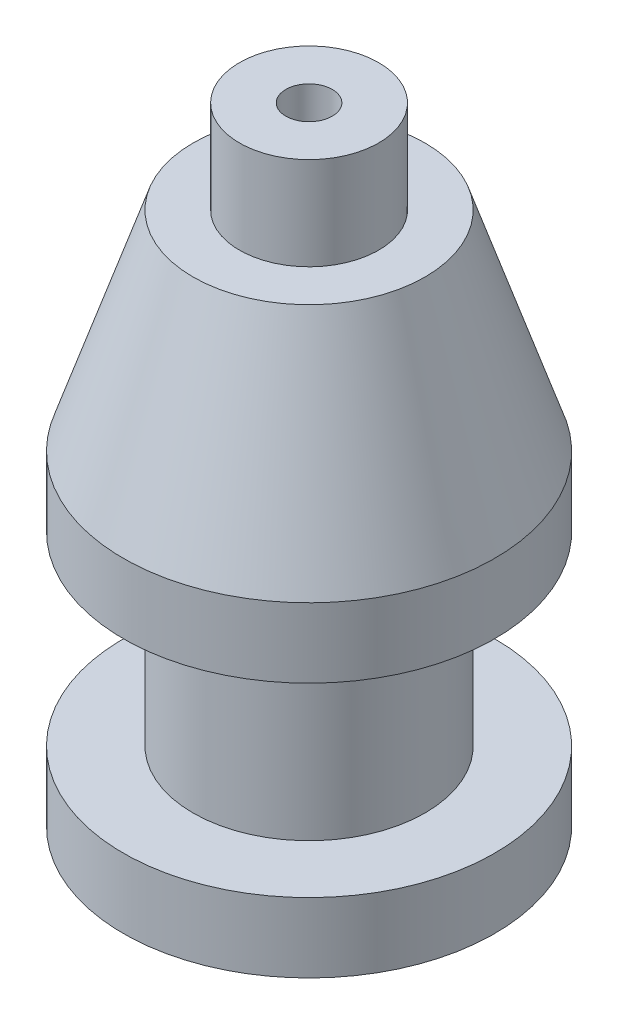
ISO-10303-21;
HEADER;
FILE_DESCRIPTION(('STEP AP214'),'2;1');
FILE_NAME('part.step','',(''),(''),'','','');
FILE_SCHEMA(('AUTOMOTIVE_DESIGN { 1 0 10303 214 1 1 1 1 }'));
ENDSEC;
DATA;
#1=APPLICATION_CONTEXT('core data for automotive mechanical design processes');
#2=APPLICATION_PROTOCOL_DEFINITION('international standard','automotive_design',2000,#1);
#3=PRODUCT_CONTEXT('',#1,'mechanical');
#4=PRODUCT('Part','Part','',(#3));
#5=PRODUCT_RELATED_PRODUCT_CATEGORY('part','',(#4));
#6=PRODUCT_DEFINITION_FORMATION('','',#4);
#7=PRODUCT_DEFINITION_CONTEXT('part definition',#1,'design');
#8=PRODUCT_DEFINITION('design','',#6,#7);
#9=PRODUCT_DEFINITION_SHAPE('','',#8);
#10=(LENGTH_UNIT() NAMED_UNIT(*) SI_UNIT(.MILLI.,.METRE.));
#11=(NAMED_UNIT(*) PLANE_ANGLE_UNIT() SI_UNIT($,.RADIAN.));
#12=(NAMED_UNIT(*) SI_UNIT($,.STERADIAN.) SOLID_ANGLE_UNIT());
#13=UNCERTAINTY_MEASURE_WITH_UNIT(LENGTH_MEASURE(1.E-05),#10,'distance_accuracy_value','');
#14=(GEOMETRIC_REPRESENTATION_CONTEXT(3) GLOBAL_UNCERTAINTY_ASSIGNED_CONTEXT((#13)) GLOBAL_UNIT_ASSIGNED_CONTEXT((#10,
#11,#12)) REPRESENTATION_CONTEXT('',''));
#15=CARTESIAN_POINT('',(0.,0.,0.));
#16=DIRECTION('',(0.,0.,1.));
#17=DIRECTION('',(1.,0.,0.));
#18=AXIS2_PLACEMENT_3D('',#15,#16,#17);
#19=CARTESIAN_POINT('',(30.,270.,0.));
#20=DIRECTION('',(0.,1.,0.));
#21=DIRECTION('',(0.,0.,1.));
#22=AXIS2_PLACEMENT_3D('',#19,#20,#21);
#23=PLANE('',#22);
#24=CARTESIAN_POINT('',(0.,270.,0.));
#25=DIRECTION('',(0.,-1.,0.));
#26=DIRECTION('',(0.,0.,-1.));
#27=AXIS2_PLACEMENT_3D('',#24,#25,#26);
#28=CIRCLE('',#27,10.);
#29=CARTESIAN_POINT('',(0.,270.,-10.));
#30=VERTEX_POINT('',#29);
#31=EDGE_CURVE('E10',#30,#30,#28,.T.);
#32=ORIENTED_EDGE('',*,*,#31,.T.);
#33=EDGE_LOOP('',(#32));
#34=FACE_BOUND('',#33,.T.);
#35=CARTESIAN_POINT('',(0.,270.,0.));
#36=DIRECTION('',(0.,-1.,0.));
#37=DIRECTION('',(0.,0.,-1.));
#38=AXIS2_PLACEMENT_3D('',#35,#36,#37);
#39=CIRCLE('',#38,30.);
#40=CARTESIAN_POINT('',(0.,270.,-30.));
#41=VERTEX_POINT('',#40);
#42=EDGE_CURVE('E72',#41,#41,#39,.T.);
#43=ORIENTED_EDGE('',*,*,#42,.F.);
#44=EDGE_LOOP('',(#43));
#45=FACE_BOUND('',#44,.T.);
#46=ADVANCED_FACE('F35',(#34,#45),#23,.T.);
#47=CARTESIAN_POINT('',(0.,0.,0.));
#48=DIRECTION('',(0.,-1.,0.));
#49=DIRECTION('',(0.,0.,-1.));
#50=AXIS2_PLACEMENT_3D('',#47,#48,#49);
#51=CYLINDRICAL_SURFACE('',#50,10.);
#52=CARTESIAN_POINT('',(0.,0.,0.));
#53=DIRECTION('',(0.,-1.,0.));
#54=DIRECTION('',(0.,0.,-1.));
#55=AXIS2_PLACEMENT_3D('',#52,#53,#54);
#56=CIRCLE('',#55,10.);
#57=CARTESIAN_POINT('',(0.,0.,-10.));
#58=VERTEX_POINT('',#57);
#59=EDGE_CURVE('E41',#58,#58,#56,.T.);
#60=ORIENTED_EDGE('',*,*,#59,.T.);
#61=EDGE_LOOP('',(#60));
#62=FACE_BOUND('',#61,.T.);
#63=ORIENTED_EDGE('',*,*,#31,.F.);
#64=EDGE_LOOP('',(#63));
#65=FACE_BOUND('',#64,.T.);
#66=ADVANCED_FACE('F80',(#62,#65),#51,.F.);
#67=CARTESIAN_POINT('',(10.,0.,0.));
#68=DIRECTION('',(0.,-1.,0.));
#69=DIRECTION('',(0.,0.,-1.));
#70=AXIS2_PLACEMENT_3D('',#67,#68,#69);
#71=PLANE('',#70);
#72=CARTESIAN_POINT('',(0.,0.,0.));
#73=DIRECTION('',(0.,-1.,0.));
#74=DIRECTION('',(0.,0.,-1.));
#75=AXIS2_PLACEMENT_3D('',#72,#73,#74);
#76=CIRCLE('',#75,80.);
#77=CARTESIAN_POINT('',(0.,0.,-80.));
#78=VERTEX_POINT('',#77);
#79=EDGE_CURVE('E45',#78,#78,#76,.T.);
#80=ORIENTED_EDGE('',*,*,#79,.T.);
#81=EDGE_LOOP('',(#80));
#82=FACE_BOUND('',#81,.T.);
#83=ORIENTED_EDGE('',*,*,#59,.F.);
#84=EDGE_LOOP('',(#83));
#85=FACE_BOUND('',#84,.T.);
#86=ADVANCED_FACE('F84',(#82,#85),#71,.T.);
#87=CARTESIAN_POINT('',(0.,0.,0.));
#88=DIRECTION('',(0.,-1.,0.));
#89=DIRECTION('',(0.,0.,-1.));
#90=AXIS2_PLACEMENT_3D('',#87,#88,#89);
#91=CYLINDRICAL_SURFACE('',#90,80.);
#92=CARTESIAN_POINT('',(0.,30.,0.));
#93=DIRECTION('',(0.,-1.,0.));
#94=DIRECTION('',(0.,0.,-1.));
#95=AXIS2_PLACEMENT_3D('',#92,#93,#94);
#96=CIRCLE('',#95,80.);
#97=CARTESIAN_POINT('',(0.,30.,-80.));
#98=VERTEX_POINT('',#97);
#99=EDGE_CURVE('E49',#98,#98,#96,.T.);
#100=ORIENTED_EDGE('',*,*,#99,.T.);
#101=EDGE_LOOP('',(#100));
#102=FACE_BOUND('',#101,.T.);
#103=ORIENTED_EDGE('',*,*,#79,.F.);
#104=EDGE_LOOP('',(#103));
#105=FACE_BOUND('',#104,.T.);
#106=ADVANCED_FACE('F88',(#102,#105),#91,.T.);
#107=CARTESIAN_POINT('',(80.,30.,0.));
#108=DIRECTION('',(0.,1.,0.));
#109=DIRECTION('',(0.,0.,1.));
#110=AXIS2_PLACEMENT_3D('',#107,#108,#109);
#111=PLANE('',#110);
#112=CARTESIAN_POINT('',(0.,30.,0.));
#113=DIRECTION('',(0.,-1.,0.));
#114=DIRECTION('',(0.,0.,-1.));
#115=AXIS2_PLACEMENT_3D('',#112,#113,#114);
#116=CIRCLE('',#115,50.);
#117=CARTESIAN_POINT('',(0.,30.,-50.));
#118=VERTEX_POINT('',#117);
#119=EDGE_CURVE('E54',#118,#118,#116,.T.);
#120=ORIENTED_EDGE('',*,*,#119,.T.);
#121=EDGE_LOOP('',(#120));
#122=FACE_BOUND('',#121,.T.);
#123=ORIENTED_EDGE('',*,*,#99,.F.);
#124=EDGE_LOOP('',(#123));
#125=FACE_BOUND('',#124,.T.);
#126=ADVANCED_FACE('F95',(#122,#125),#111,.T.);
#127=CARTESIAN_POINT('',(0.,0.,0.));
#128=DIRECTION('',(0.,-1.,0.));
#129=DIRECTION('',(0.,0.,-1.));
#130=AXIS2_PLACEMENT_3D('',#127,#128,#129);
#131=CYLINDRICAL_SURFACE('',#130,50.);
#132=CARTESIAN_POINT('',(0.,110.,0.));
#133=DIRECTION('',(0.,-1.,0.));
#134=DIRECTION('',(0.,0.,-1.));
#135=AXIS2_PLACEMENT_3D('',#132,#133,#134);
#136=CIRCLE('',#135,50.);
#137=CARTESIAN_POINT('',(0.,110.,-50.));
#138=VERTEX_POINT('',#137);
#139=EDGE_CURVE('E57',#138,#138,#136,.T.);
#140=ORIENTED_EDGE('',*,*,#139,.T.);
#141=EDGE_LOOP('',(#140));
#142=FACE_BOUND('',#141,.T.);
#143=ORIENTED_EDGE('',*,*,#119,.F.);
#144=EDGE_LOOP('',(#143));
#145=FACE_BOUND('',#144,.T.);
#146=ADVANCED_FACE('F99',(#142,#145),#131,.T.);
#147=CARTESIAN_POINT('',(50.,110.,0.));
#148=DIRECTION('',(0.,-1.,0.));
#149=DIRECTION('',(0.,0.,-1.));
#150=AXIS2_PLACEMENT_3D('',#147,#148,#149);
#151=PLANE('',#150);
#152=CARTESIAN_POINT('',(0.,110.,0.));
#153=DIRECTION('',(0.,-1.,0.));
#154=DIRECTION('',(0.,0.,-1.));
#155=AXIS2_PLACEMENT_3D('',#152,#153,#154);
#156=CIRCLE('',#155,80.);
#157=CARTESIAN_POINT('',(0.,110.,-80.));
#158=VERTEX_POINT('',#157);
#159=EDGE_CURVE('E60',#158,#158,#156,.T.);
#160=ORIENTED_EDGE('',*,*,#159,.T.);
#161=EDGE_LOOP('',(#160));
#162=FACE_BOUND('',#161,.T.);
#163=ORIENTED_EDGE('',*,*,#139,.F.);
#164=EDGE_LOOP('',(#163));
#165=FACE_BOUND('',#164,.T.);
#166=ADVANCED_FACE('F103',(#162,#165),#151,.T.);
#167=CARTESIAN_POINT('',(0.,0.,0.));
#168=DIRECTION('',(0.,-1.,0.));
#169=DIRECTION('',(0.,0.,-1.));
#170=AXIS2_PLACEMENT_3D('',#167,#168,#169);
#171=CYLINDRICAL_SURFACE('',#170,80.);
#172=CARTESIAN_POINT('',(0.,140.,0.));
#173=DIRECTION('',(0.,-1.,0.));
#174=DIRECTION('',(0.,0.,-1.));
#175=AXIS2_PLACEMENT_3D('',#172,#173,#174);
#176=CIRCLE('',#175,80.);
#177=CARTESIAN_POINT('',(0.,140.,-80.));
#178=VERTEX_POINT('',#177);
#179=EDGE_CURVE('E63',#178,#178,#176,.T.);
#180=ORIENTED_EDGE('',*,*,#179,.T.);
#181=EDGE_LOOP('',(#180));
#182=FACE_BOUND('',#181,.T.);
#183=ORIENTED_EDGE('',*,*,#159,.F.);
#184=EDGE_LOOP('',(#183));
#185=FACE_BOUND('',#184,.T.);
#186=ADVANCED_FACE('F107',(#182,#185),#171,.T.);
#187=CARTESIAN_POINT('',(0.,140.,0.));
#188=DIRECTION('',(0.,-1.,0.));
#189=DIRECTION('',(0.,0.,-1.));
#190=AXIS2_PLACEMENT_3D('',#187,#188,#189);
#191=CONICAL_SURFACE('',#190,80.,0.321750554396642);
#192=CARTESIAN_POINT('',(0.,230.,0.));
#193=DIRECTION('',(0.,-1.,0.));
#194=DIRECTION('',(0.,0.,-1.));
#195=AXIS2_PLACEMENT_3D('',#192,#193,#194);
#196=CIRCLE('',#195,50.);
#197=CARTESIAN_POINT('',(0.,230.,-50.));
#198=VERTEX_POINT('',#197);
#199=EDGE_CURVE('E66',#198,#198,#196,.T.);
#200=ORIENTED_EDGE('',*,*,#199,.T.);
#201=EDGE_LOOP('',(#200));
#202=FACE_BOUND('',#201,.T.);
#203=ORIENTED_EDGE('',*,*,#179,.F.);
#204=EDGE_LOOP('',(#203));
#205=FACE_BOUND('',#204,.T.);
#206=ADVANCED_FACE('F111',(#202,#205),#191,.T.);
#207=CARTESIAN_POINT('',(50.,230.,0.));
#208=DIRECTION('',(0.,1.,0.));
#209=DIRECTION('',(0.,0.,1.));
#210=AXIS2_PLACEMENT_3D('',#207,#208,#209);
#211=PLANE('',#210);
#212=CARTESIAN_POINT('',(0.,230.,0.));
#213=DIRECTION('',(0.,-1.,0.));
#214=DIRECTION('',(0.,0.,-1.));
#215=AXIS2_PLACEMENT_3D('',#212,#213,#214);
#216=CIRCLE('',#215,30.);
#217=CARTESIAN_POINT('',(0.,230.,-30.));
#218=VERTEX_POINT('',#217);
#219=EDGE_CURVE('E69',#218,#218,#216,.T.);
#220=ORIENTED_EDGE('',*,*,#219,.T.);
#221=EDGE_LOOP('',(#220));
#222=FACE_BOUND('',#221,.T.);
#223=ORIENTED_EDGE('',*,*,#199,.F.);
#224=EDGE_LOOP('',(#223));
#225=FACE_BOUND('',#224,.T.);
#226=ADVANCED_FACE('F115',(#222,#225),#211,.T.);
#227=CARTESIAN_POINT('',(0.,0.,0.));
#228=DIRECTION('',(0.,-1.,0.));
#229=DIRECTION('',(0.,0.,-1.));
#230=AXIS2_PLACEMENT_3D('',#227,#228,#229);
#231=CYLINDRICAL_SURFACE('',#230,30.);
#232=ORIENTED_EDGE('',*,*,#42,.T.);
#233=EDGE_LOOP('',(#232));
#234=FACE_BOUND('',#233,.T.);
#235=ORIENTED_EDGE('',*,*,#219,.F.);
#236=EDGE_LOOP('',(#235));
#237=FACE_BOUND('',#236,.T.);
#238=ADVANCED_FACE('F76',(#234,#237),#231,.T.);
#239=CLOSED_SHELL('',(#46,#66,#86,#106,#126,#146,#166,#186,#206,#226,#238));
#240=MANIFOLD_SOLID_BREP('B2',#239);
#241=ADVANCED_BREP_SHAPE_REPRESENTATION('',(#18,#240),#14);
#242=SHAPE_DEFINITION_REPRESENTATION(#9,#241);
ENDSEC;
END-ISO-10303-21;
